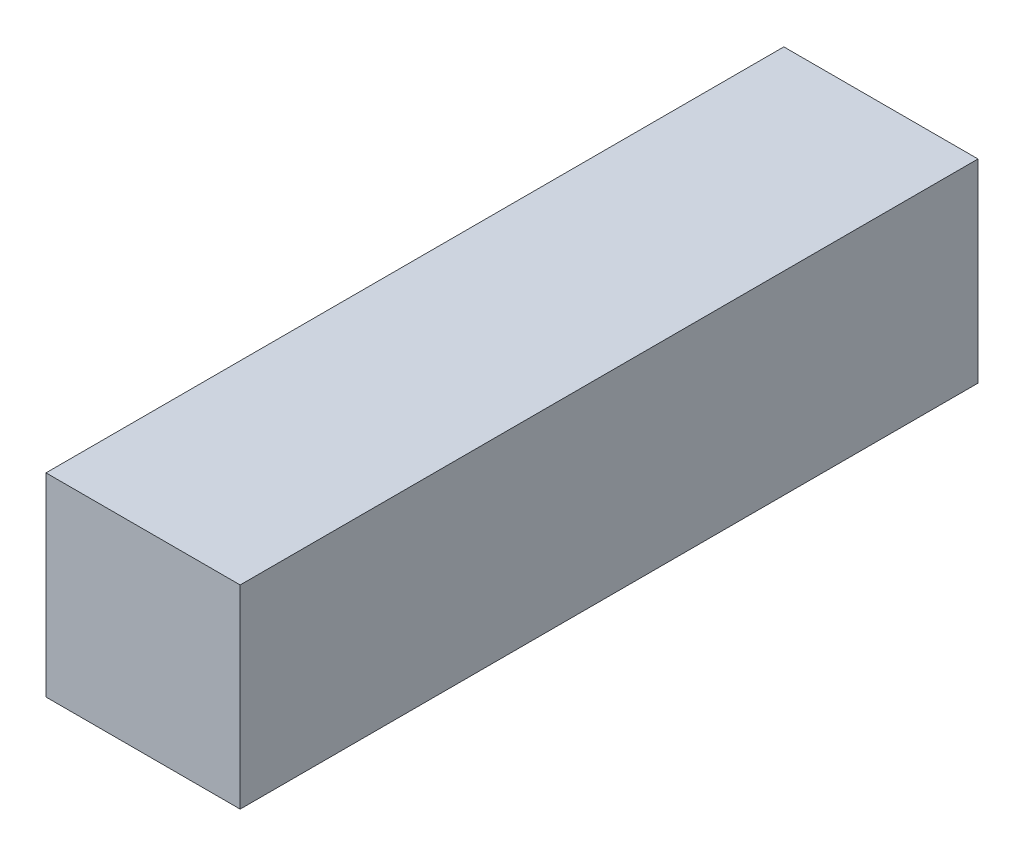
ISO-10303-21;
HEADER;
FILE_DESCRIPTION(('STEP AP214'),'2;1');
FILE_NAME('part.step','',(''),(''),'','','');
FILE_SCHEMA(('AUTOMOTIVE_DESIGN { 1 0 10303 214 1 1 1 1 }'));
ENDSEC;
DATA;
#1=APPLICATION_CONTEXT('core data for automotive mechanical design processes');
#2=APPLICATION_PROTOCOL_DEFINITION('international standard','automotive_design',2000,#1);
#3=PRODUCT_CONTEXT('',#1,'mechanical');
#4=PRODUCT('Part','Part','',(#3));
#5=PRODUCT_RELATED_PRODUCT_CATEGORY('part','',(#4));
#6=PRODUCT_DEFINITION_FORMATION('','',#4);
#7=PRODUCT_DEFINITION_CONTEXT('part definition',#1,'design');
#8=PRODUCT_DEFINITION('design','',#6,#7);
#9=PRODUCT_DEFINITION_SHAPE('','',#8);
#10=(LENGTH_UNIT() NAMED_UNIT(*) SI_UNIT(.MILLI.,.METRE.));
#11=(NAMED_UNIT(*) PLANE_ANGLE_UNIT() SI_UNIT($,.RADIAN.));
#12=(NAMED_UNIT(*) SI_UNIT($,.STERADIAN.) SOLID_ANGLE_UNIT());
#13=UNCERTAINTY_MEASURE_WITH_UNIT(LENGTH_MEASURE(1.E-05),#10,'distance_accuracy_value','');
#14=(GEOMETRIC_REPRESENTATION_CONTEXT(3) GLOBAL_UNCERTAINTY_ASSIGNED_CONTEXT((#13)) GLOBAL_UNIT_ASSIGNED_CONTEXT((#10,
#11,#12)) REPRESENTATION_CONTEXT('',''));
#15=CARTESIAN_POINT('',(0.,0.,0.));
#16=DIRECTION('',(0.,0.,1.));
#17=DIRECTION('',(1.,0.,0.));
#18=AXIS2_PLACEMENT_3D('',#15,#16,#17);
#19=CARTESIAN_POINT('',(0.,0.,120.65));
#20=DIRECTION('',(1.,0.,0.));
#21=DIRECTION('',(0.,0.,-1.));
#22=AXIS2_PLACEMENT_3D('',#19,#20,#21);
#23=PLANE('',#22);
#24=DIRECTION('',(0.,-1.,0.));
#25=VECTOR('',#24,1.);
#26=CARTESIAN_POINT('',(0.,0.,0.));
#27=LINE('',#26,#25);
#28=CARTESIAN_POINT('',(0.,31.75,0.));
#29=VERTEX_POINT('',#28);
#30=CARTESIAN_POINT('',(0.,0.,0.));
#31=VERTEX_POINT('',#30);
#32=EDGE_CURVE('E94',#29,#31,#27,.T.);
#33=ORIENTED_EDGE('',*,*,#32,.T.);
#34=DIRECTION('',(0.,0.,-1.));
#35=VECTOR('',#34,1.);
#36=CARTESIAN_POINT('',(0.,0.,120.65));
#37=LINE('',#36,#35);
#38=CARTESIAN_POINT('',(0.,0.,120.65));
#39=VERTEX_POINT('',#38);
#40=EDGE_CURVE('E11',#39,#31,#37,.T.);
#41=ORIENTED_EDGE('',*,*,#40,.F.);
#42=DIRECTION('',(0.,-1.,0.));
#43=VECTOR('',#42,1.);
#44=CARTESIAN_POINT('',(0.,0.,120.65));
#45=LINE('',#44,#43);
#46=CARTESIAN_POINT('',(0.,31.75,120.65));
#47=VERTEX_POINT('',#46);
#48=EDGE_CURVE('E82',#47,#39,#45,.T.);
#49=ORIENTED_EDGE('',*,*,#48,.F.);
#50=DIRECTION('',(0.,0.,-1.));
#51=VECTOR('',#50,1.);
#52=CARTESIAN_POINT('',(0.,31.75,120.65));
#53=LINE('',#52,#51);
#54=EDGE_CURVE('E90',#47,#29,#53,.T.);
#55=ORIENTED_EDGE('',*,*,#54,.T.);
#56=EDGE_LOOP('',(#33,#41,#49,#55));
#57=FACE_BOUND('',#56,.T.);
#58=ADVANCED_FACE('F31',(#57),#23,.F.);
#59=CARTESIAN_POINT('',(0.,0.,120.65));
#60=DIRECTION('',(0.,1.,0.));
#61=DIRECTION('',(0.,0.,1.));
#62=AXIS2_PLACEMENT_3D('',#59,#60,#61);
#63=PLANE('',#62);
#64=DIRECTION('',(1.,0.,0.));
#65=VECTOR('',#64,1.);
#66=CARTESIAN_POINT('',(0.,0.,0.));
#67=LINE('',#66,#65);
#68=CARTESIAN_POINT('',(31.75,0.,0.));
#69=VERTEX_POINT('',#68);
#70=EDGE_CURVE('E86',#31,#69,#67,.T.);
#71=ORIENTED_EDGE('',*,*,#70,.T.);
#72=DIRECTION('',(0.,0.,-1.));
#73=VECTOR('',#72,1.);
#74=CARTESIAN_POINT('',(31.75,0.,120.65));
#75=LINE('',#74,#73);
#76=CARTESIAN_POINT('',(31.75,0.,120.65));
#77=VERTEX_POINT('',#76);
#78=EDGE_CURVE('E39',#77,#69,#75,.T.);
#79=ORIENTED_EDGE('',*,*,#78,.F.);
#80=DIRECTION('',(1.,0.,0.));
#81=VECTOR('',#80,1.);
#82=CARTESIAN_POINT('',(0.,0.,120.65));
#83=LINE('',#82,#81);
#84=EDGE_CURVE('E77',#39,#77,#83,.T.);
#85=ORIENTED_EDGE('',*,*,#84,.F.);
#86=ORIENTED_EDGE('',*,*,#40,.T.);
#87=EDGE_LOOP('',(#71,#79,#85,#86));
#88=FACE_BOUND('',#87,.T.);
#89=ADVANCED_FACE('F85',(#88),#63,.F.);
#90=CARTESIAN_POINT('',(31.75,0.,120.65));
#91=DIRECTION('',(-1.,0.,0.));
#92=DIRECTION('',(0.,0.,1.));
#93=AXIS2_PLACEMENT_3D('',#90,#91,#92);
#94=PLANE('',#93);
#95=DIRECTION('',(0.,1.,0.));
#96=VECTOR('',#95,1.);
#97=CARTESIAN_POINT('',(31.75,0.,0.));
#98=LINE('',#97,#96);
#99=CARTESIAN_POINT('',(31.75,31.75,0.));
#100=VERTEX_POINT('',#99);
#101=EDGE_CURVE('E64',#69,#100,#98,.T.);
#102=ORIENTED_EDGE('',*,*,#101,.T.);
#103=DIRECTION('',(0.,0.,-1.));
#104=VECTOR('',#103,1.);
#105=CARTESIAN_POINT('',(31.75,31.75,120.65));
#106=LINE('',#105,#104);
#107=CARTESIAN_POINT('',(31.75,31.75,120.65));
#108=VERTEX_POINT('',#107);
#109=EDGE_CURVE('E87',#108,#100,#106,.T.);
#110=ORIENTED_EDGE('',*,*,#109,.F.);
#111=DIRECTION('',(0.,1.,0.));
#112=VECTOR('',#111,1.);
#113=CARTESIAN_POINT('',(31.75,0.,120.65));
#114=LINE('',#113,#112);
#115=EDGE_CURVE('E80',#77,#108,#114,.T.);
#116=ORIENTED_EDGE('',*,*,#115,.F.);
#117=ORIENTED_EDGE('',*,*,#78,.T.);
#118=EDGE_LOOP('',(#102,#110,#116,#117));
#119=FACE_BOUND('',#118,.T.);
#120=ADVANCED_FACE('F88',(#119),#94,.F.);
#121=CARTESIAN_POINT('',(0.,31.75,120.65));
#122=DIRECTION('',(0.,-1.,0.));
#123=DIRECTION('',(0.,0.,-1.));
#124=AXIS2_PLACEMENT_3D('',#121,#122,#123);
#125=PLANE('',#124);
#126=DIRECTION('',(-1.,0.,0.));
#127=VECTOR('',#126,1.);
#128=CARTESIAN_POINT('',(0.,31.75,0.));
#129=LINE('',#128,#127);
#130=EDGE_CURVE('E70',#100,#29,#129,.T.);
#131=ORIENTED_EDGE('',*,*,#130,.T.);
#132=ORIENTED_EDGE('',*,*,#54,.F.);
#133=DIRECTION('',(-1.,0.,0.));
#134=VECTOR('',#133,1.);
#135=CARTESIAN_POINT('',(0.,31.75,120.65));
#136=LINE('',#135,#134);
#137=EDGE_CURVE('E47',#108,#47,#136,.T.);
#138=ORIENTED_EDGE('',*,*,#137,.F.);
#139=ORIENTED_EDGE('',*,*,#109,.T.);
#140=EDGE_LOOP('',(#131,#132,#138,#139));
#141=FACE_BOUND('',#140,.T.);
#142=ADVANCED_FACE('F101',(#141),#125,.F.);
#143=CARTESIAN_POINT('',(0.,31.75,120.65));
#144=DIRECTION('',(0.,0.,-1.));
#145=DIRECTION('',(-1.,0.,0.));
#146=AXIS2_PLACEMENT_3D('',#143,#144,#145);
#147=PLANE('',#146);
#148=ORIENTED_EDGE('',*,*,#48,.T.);
#149=ORIENTED_EDGE('',*,*,#84,.T.);
#150=ORIENTED_EDGE('',*,*,#115,.T.);
#151=ORIENTED_EDGE('',*,*,#137,.T.);
#152=EDGE_LOOP('',(#148,#149,#150,#151));
#153=FACE_BOUND('',#152,.T.);
#154=ADVANCED_FACE('F78',(#153),#147,.F.);
#155=CARTESIAN_POINT('',(0.,31.75,0.));
#156=DIRECTION('',(0.,0.,-1.));
#157=DIRECTION('',(-1.,0.,0.));
#158=AXIS2_PLACEMENT_3D('',#155,#156,#157);
#159=PLANE('',#158);
#160=ORIENTED_EDGE('',*,*,#32,.F.);
#161=ORIENTED_EDGE('',*,*,#130,.F.);
#162=ORIENTED_EDGE('',*,*,#101,.F.);
#163=ORIENTED_EDGE('',*,*,#70,.F.);
#164=EDGE_LOOP('',(#160,#161,#162,#163));
#165=FACE_BOUND('',#164,.T.);
#166=ADVANCED_FACE('F104',(#165),#159,.T.);
#167=CLOSED_SHELL('',(#58,#89,#120,#142,#154,#166));
#168=MANIFOLD_SOLID_BREP('B2',#167);
#169=ADVANCED_BREP_SHAPE_REPRESENTATION('',(#18,#168),#14);
#170=SHAPE_DEFINITION_REPRESENTATION(#9,#169);
ENDSEC;
END-ISO-10303-21;
